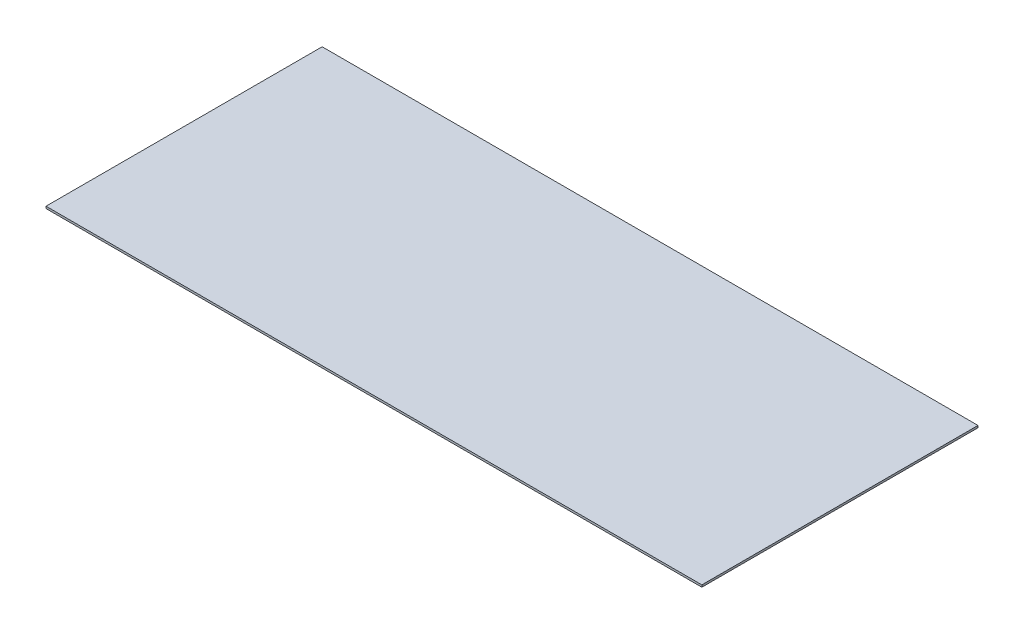
ISO-10303-21;
HEADER;
FILE_DESCRIPTION(('STEP AP214'),'2;1');
FILE_NAME('part.step','',(''),(''),'','','');
FILE_SCHEMA(('AUTOMOTIVE_DESIGN { 1 0 10303 214 1 1 1 1 }'));
ENDSEC;
DATA;
#1=APPLICATION_CONTEXT('core data for automotive mechanical design processes');
#2=APPLICATION_PROTOCOL_DEFINITION('international standard','automotive_design',2000,#1);
#3=PRODUCT_CONTEXT('',#1,'mechanical');
#4=PRODUCT('Part','Part','',(#3));
#5=PRODUCT_RELATED_PRODUCT_CATEGORY('part','',(#4));
#6=PRODUCT_DEFINITION_FORMATION('','',#4);
#7=PRODUCT_DEFINITION_CONTEXT('part definition',#1,'design');
#8=PRODUCT_DEFINITION('design','',#6,#7);
#9=PRODUCT_DEFINITION_SHAPE('','',#8);
#10=(LENGTH_UNIT() NAMED_UNIT(*) SI_UNIT(.MILLI.,.METRE.));
#11=(NAMED_UNIT(*) PLANE_ANGLE_UNIT() SI_UNIT($,.RADIAN.));
#12=(NAMED_UNIT(*) SI_UNIT($,.STERADIAN.) SOLID_ANGLE_UNIT());
#13=UNCERTAINTY_MEASURE_WITH_UNIT(LENGTH_MEASURE(1.E-05),#10,'distance_accuracy_value','');
#14=(GEOMETRIC_REPRESENTATION_CONTEXT(3) GLOBAL_UNCERTAINTY_ASSIGNED_CONTEXT((#13)) GLOBAL_UNIT_ASSIGNED_CONTEXT((#10,
#11,#12)) REPRESENTATION_CONTEXT('',''));
#15=CARTESIAN_POINT('',(0.,0.,0.));
#16=DIRECTION('',(0.,0.,1.));
#17=DIRECTION('',(1.,0.,0.));
#18=AXIS2_PLACEMENT_3D('',#15,#16,#17);
#19=CARTESIAN_POINT('',(950.,6.,400.));
#20=DIRECTION('',(-1.,0.,0.));
#21=DIRECTION('',(0.,0.,1.));
#22=AXIS2_PLACEMENT_3D('',#19,#20,#21);
#23=PLANE('',#22);
#24=DIRECTION('',(0.,0.,-1.));
#25=VECTOR('',#24,1.);
#26=CARTESIAN_POINT('',(950.,0.,400.));
#27=LINE('',#26,#25);
#28=CARTESIAN_POINT('',(950.,0.,400.));
#29=VERTEX_POINT('',#28);
#30=CARTESIAN_POINT('',(950.,0.,-400.));
#31=VERTEX_POINT('',#30);
#32=EDGE_CURVE('E98',#29,#31,#27,.T.);
#33=ORIENTED_EDGE('',*,*,#32,.T.);
#34=DIRECTION('',(0.,-1.,0.));
#35=VECTOR('',#34,1.);
#36=CARTESIAN_POINT('',(950.,6.,-400.));
#37=LINE('',#36,#35);
#38=CARTESIAN_POINT('',(950.,6.,-400.));
#39=VERTEX_POINT('',#38);
#40=EDGE_CURVE('E11',#39,#31,#37,.T.);
#41=ORIENTED_EDGE('',*,*,#40,.F.);
#42=DIRECTION('',(0.,0.,-1.));
#43=VECTOR('',#42,1.);
#44=CARTESIAN_POINT('',(950.,6.,400.));
#45=LINE('',#44,#43);
#46=CARTESIAN_POINT('',(950.,6.,400.));
#47=VERTEX_POINT('',#46);
#48=EDGE_CURVE('E86',#47,#39,#45,.T.);
#49=ORIENTED_EDGE('',*,*,#48,.F.);
#50=DIRECTION('',(0.,-1.,0.));
#51=VECTOR('',#50,1.);
#52=CARTESIAN_POINT('',(950.,6.,400.));
#53=LINE('',#52,#51);
#54=EDGE_CURVE('E94',#47,#29,#53,.T.);
#55=ORIENTED_EDGE('',*,*,#54,.T.);
#56=EDGE_LOOP('',(#33,#41,#49,#55));
#57=FACE_BOUND('',#56,.T.);
#58=ADVANCED_FACE('F35',(#57),#23,.F.);
#59=CARTESIAN_POINT('',(-950.,6.,-400.));
#60=DIRECTION('',(0.,0.,1.));
#61=DIRECTION('',(1.,0.,0.));
#62=AXIS2_PLACEMENT_3D('',#59,#60,#61);
#63=PLANE('',#62);
#64=DIRECTION('',(-1.,0.,0.));
#65=VECTOR('',#64,1.);
#66=CARTESIAN_POINT('',(-950.,0.,-400.));
#67=LINE('',#66,#65);
#68=CARTESIAN_POINT('',(-950.,0.,-400.));
#69=VERTEX_POINT('',#68);
#70=EDGE_CURVE('E90',#31,#69,#67,.T.);
#71=ORIENTED_EDGE('',*,*,#70,.T.);
#72=DIRECTION('',(0.,-1.,0.));
#73=VECTOR('',#72,1.);
#74=CARTESIAN_POINT('',(-950.,6.,-400.));
#75=LINE('',#74,#73);
#76=CARTESIAN_POINT('',(-950.,6.,-400.));
#77=VERTEX_POINT('',#76);
#78=EDGE_CURVE('E43',#77,#69,#75,.T.);
#79=ORIENTED_EDGE('',*,*,#78,.F.);
#80=DIRECTION('',(-1.,0.,0.));
#81=VECTOR('',#80,1.);
#82=CARTESIAN_POINT('',(-950.,6.,-400.));
#83=LINE('',#82,#81);
#84=EDGE_CURVE('E81',#39,#77,#83,.T.);
#85=ORIENTED_EDGE('',*,*,#84,.F.);
#86=ORIENTED_EDGE('',*,*,#40,.T.);
#87=EDGE_LOOP('',(#71,#79,#85,#86));
#88=FACE_BOUND('',#87,.T.);
#89=ADVANCED_FACE('F89',(#88),#63,.F.);
#90=CARTESIAN_POINT('',(-950.,6.,400.));
#91=DIRECTION('',(1.,0.,0.));
#92=DIRECTION('',(0.,0.,-1.));
#93=AXIS2_PLACEMENT_3D('',#90,#91,#92);
#94=PLANE('',#93);
#95=DIRECTION('',(0.,0.,1.));
#96=VECTOR('',#95,1.);
#97=CARTESIAN_POINT('',(-950.,0.,400.));
#98=LINE('',#97,#96);
#99=CARTESIAN_POINT('',(-950.,0.,400.));
#100=VERTEX_POINT('',#99);
#101=EDGE_CURVE('E68',#69,#100,#98,.T.);
#102=ORIENTED_EDGE('',*,*,#101,.T.);
#103=DIRECTION('',(0.,-1.,0.));
#104=VECTOR('',#103,1.);
#105=CARTESIAN_POINT('',(-950.,6.,400.));
#106=LINE('',#105,#104);
#107=CARTESIAN_POINT('',(-950.,6.,400.));
#108=VERTEX_POINT('',#107);
#109=EDGE_CURVE('E91',#108,#100,#106,.T.);
#110=ORIENTED_EDGE('',*,*,#109,.F.);
#111=DIRECTION('',(0.,0.,1.));
#112=VECTOR('',#111,1.);
#113=CARTESIAN_POINT('',(-950.,6.,400.));
#114=LINE('',#113,#112);
#115=EDGE_CURVE('E84',#77,#108,#114,.T.);
#116=ORIENTED_EDGE('',*,*,#115,.F.);
#117=ORIENTED_EDGE('',*,*,#78,.T.);
#118=EDGE_LOOP('',(#102,#110,#116,#117));
#119=FACE_BOUND('',#118,.T.);
#120=ADVANCED_FACE('F92',(#119),#94,.F.);
#121=CARTESIAN_POINT('',(-950.,6.,400.));
#122=DIRECTION('',(0.,0.,-1.));
#123=DIRECTION('',(-1.,0.,0.));
#124=AXIS2_PLACEMENT_3D('',#121,#122,#123);
#125=PLANE('',#124);
#126=DIRECTION('',(1.,0.,0.));
#127=VECTOR('',#126,1.);
#128=CARTESIAN_POINT('',(-950.,0.,400.));
#129=LINE('',#128,#127);
#130=EDGE_CURVE('E74',#100,#29,#129,.T.);
#131=ORIENTED_EDGE('',*,*,#130,.T.);
#132=ORIENTED_EDGE('',*,*,#54,.F.);
#133=DIRECTION('',(1.,0.,0.));
#134=VECTOR('',#133,1.);
#135=CARTESIAN_POINT('',(-950.,6.,400.));
#136=LINE('',#135,#134);
#137=EDGE_CURVE('E51',#108,#47,#136,.T.);
#138=ORIENTED_EDGE('',*,*,#137,.F.);
#139=ORIENTED_EDGE('',*,*,#109,.T.);
#140=EDGE_LOOP('',(#131,#132,#138,#139));
#141=FACE_BOUND('',#140,.T.);
#142=ADVANCED_FACE('F105',(#141),#125,.F.);
#143=CARTESIAN_POINT('',(0.,6.,0.));
#144=DIRECTION('',(0.,-1.,0.));
#145=DIRECTION('',(0.,0.,-1.));
#146=AXIS2_PLACEMENT_3D('',#143,#144,#145);
#147=PLANE('',#146);
#148=ORIENTED_EDGE('',*,*,#48,.T.);
#149=ORIENTED_EDGE('',*,*,#84,.T.);
#150=ORIENTED_EDGE('',*,*,#115,.T.);
#151=ORIENTED_EDGE('',*,*,#137,.T.);
#152=EDGE_LOOP('',(#148,#149,#150,#151));
#153=FACE_BOUND('',#152,.T.);
#154=ADVANCED_FACE('F82',(#153),#147,.F.);
#155=CARTESIAN_POINT('',(0.,0.,0.));
#156=DIRECTION('',(0.,-1.,0.));
#157=DIRECTION('',(0.,0.,-1.));
#158=AXIS2_PLACEMENT_3D('',#155,#156,#157);
#159=PLANE('',#158);
#160=ORIENTED_EDGE('',*,*,#32,.F.);
#161=ORIENTED_EDGE('',*,*,#130,.F.);
#162=ORIENTED_EDGE('',*,*,#101,.F.);
#163=ORIENTED_EDGE('',*,*,#70,.F.);
#164=EDGE_LOOP('',(#160,#161,#162,#163));
#165=FACE_BOUND('',#164,.T.);
#166=ADVANCED_FACE('F108',(#165),#159,.T.);
#167=CLOSED_SHELL('',(#58,#89,#120,#142,#154,#166));
#168=MANIFOLD_SOLID_BREP('B2',#167);
#169=ADVANCED_BREP_SHAPE_REPRESENTATION('',(#18,#168),#14);
#170=SHAPE_DEFINITION_REPRESENTATION(#9,#169);
ENDSEC;
END-ISO-10303-21;
